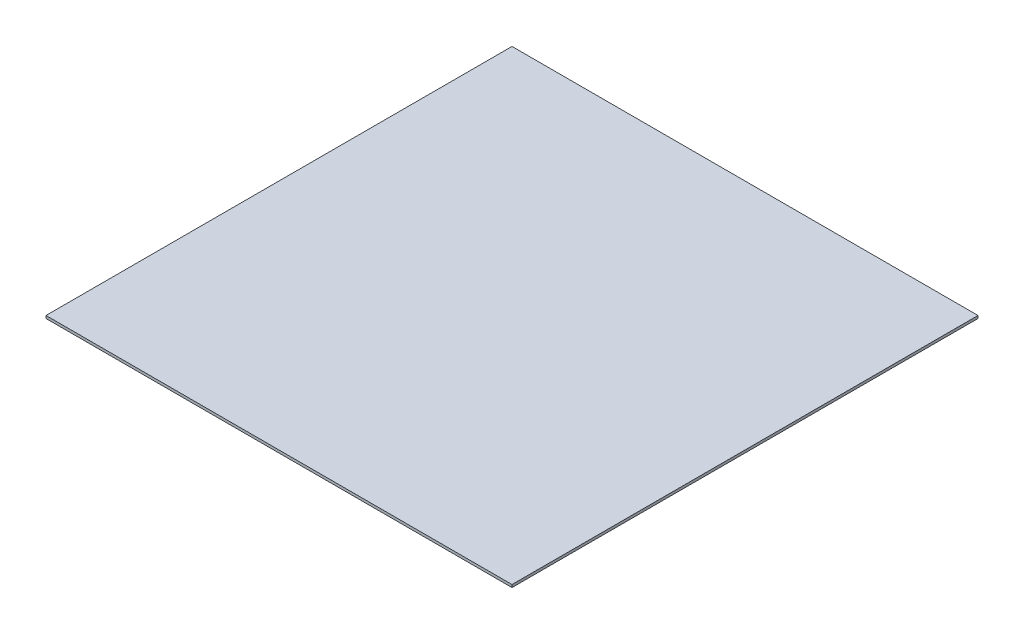
ISO-10303-21;
HEADER;
FILE_DESCRIPTION(('STEP AP214'),'2;1');
FILE_NAME('part.step','',(''),(''),'','','');
FILE_SCHEMA(('AUTOMOTIVE_DESIGN { 1 0 10303 214 1 1 1 1 }'));
ENDSEC;
DATA;
#1=APPLICATION_CONTEXT('core data for automotive mechanical design processes');
#2=APPLICATION_PROTOCOL_DEFINITION('international standard','automotive_design',2000,#1);
#3=PRODUCT_CONTEXT('',#1,'mechanical');
#4=PRODUCT('Part','Part','',(#3));
#5=PRODUCT_RELATED_PRODUCT_CATEGORY('part','',(#4));
#6=PRODUCT_DEFINITION_FORMATION('','',#4);
#7=PRODUCT_DEFINITION_CONTEXT('part definition',#1,'design');
#8=PRODUCT_DEFINITION('design','',#6,#7);
#9=PRODUCT_DEFINITION_SHAPE('','',#8);
#10=(LENGTH_UNIT() NAMED_UNIT(*) SI_UNIT(.MILLI.,.METRE.));
#11=(NAMED_UNIT(*) PLANE_ANGLE_UNIT() SI_UNIT($,.RADIAN.));
#12=(NAMED_UNIT(*) SI_UNIT($,.STERADIAN.) SOLID_ANGLE_UNIT());
#13=UNCERTAINTY_MEASURE_WITH_UNIT(LENGTH_MEASURE(1.E-05),#10,'distance_accuracy_value','');
#14=(GEOMETRIC_REPRESENTATION_CONTEXT(3) GLOBAL_UNCERTAINTY_ASSIGNED_CONTEXT((#13)) GLOBAL_UNIT_ASSIGNED_CONTEXT((#10,
#11,#12)) REPRESENTATION_CONTEXT('',''));
#15=CARTESIAN_POINT('',(0.,0.,0.));
#16=DIRECTION('',(0.,0.,1.));
#17=DIRECTION('',(1.,0.,0.));
#18=AXIS2_PLACEMENT_3D('',#15,#16,#17);
#19=CARTESIAN_POINT('',(0.,0.127,0.));
#20=DIRECTION('',(-1.,0.,0.));
#21=DIRECTION('',(0.,0.,1.));
#22=AXIS2_PLACEMENT_3D('',#19,#20,#21);
#23=PLANE('',#22);
#24=DIRECTION('',(0.,0.,-1.));
#25=VECTOR('',#24,1.);
#26=CARTESIAN_POINT('',(0.,0.,0.));
#27=LINE('',#26,#25);
#28=CARTESIAN_POINT('',(0.,0.,0.));
#29=VERTEX_POINT('',#28);
#30=CARTESIAN_POINT('',(0.,0.,-22.352));
#31=VERTEX_POINT('',#30);
#32=EDGE_CURVE('E99',#29,#31,#27,.T.);
#33=ORIENTED_EDGE('',*,*,#32,.F.);
#34=DIRECTION('',(0.,-1.,0.));
#35=VECTOR('',#34,1.);
#36=CARTESIAN_POINT('',(0.,0.127,0.));
#37=LINE('',#36,#35);
#38=CARTESIAN_POINT('',(0.,0.127,0.));
#39=VERTEX_POINT('',#38);
#40=EDGE_CURVE('E11',#39,#29,#37,.T.);
#41=ORIENTED_EDGE('',*,*,#40,.F.);
#42=DIRECTION('',(0.,0.,-1.));
#43=VECTOR('',#42,1.);
#44=CARTESIAN_POINT('',(0.,0.127,0.));
#45=LINE('',#44,#43);
#46=CARTESIAN_POINT('',(0.,0.127,-22.352));
#47=VERTEX_POINT('',#46);
#48=EDGE_CURVE('E94',#39,#47,#45,.T.);
#49=ORIENTED_EDGE('',*,*,#48,.T.);
#50=DIRECTION('',(0.,-1.,0.));
#51=VECTOR('',#50,1.);
#52=CARTESIAN_POINT('',(0.,0.127,-22.352));
#53=LINE('',#52,#51);
#54=EDGE_CURVE('E37',#47,#31,#53,.T.);
#55=ORIENTED_EDGE('',*,*,#54,.T.);
#56=EDGE_LOOP('',(#33,#41,#49,#55));
#57=FACE_BOUND('',#56,.T.);
#58=ADVANCED_FACE('F34',(#57),#23,.T.);
#59=CARTESIAN_POINT('',(0.,0.127,0.));
#60=DIRECTION('',(0.,0.,-1.));
#61=DIRECTION('',(-1.,0.,0.));
#62=AXIS2_PLACEMENT_3D('',#59,#60,#61);
#63=PLANE('',#62);
#64=DIRECTION('',(1.,0.,0.));
#65=VECTOR('',#64,1.);
#66=CARTESIAN_POINT('',(0.,0.,0.));
#67=LINE('',#66,#65);
#68=CARTESIAN_POINT('',(22.352,0.,0.));
#69=VERTEX_POINT('',#68);
#70=EDGE_CURVE('E67',#29,#69,#67,.T.);
#71=ORIENTED_EDGE('',*,*,#70,.T.);
#72=DIRECTION('',(0.,-1.,0.));
#73=VECTOR('',#72,1.);
#74=CARTESIAN_POINT('',(22.352,0.127,0.));
#75=LINE('',#74,#73);
#76=CARTESIAN_POINT('',(22.352,0.127,0.));
#77=VERTEX_POINT('',#76);
#78=EDGE_CURVE('E43',#77,#69,#75,.T.);
#79=ORIENTED_EDGE('',*,*,#78,.F.);
#80=DIRECTION('',(1.,0.,0.));
#81=VECTOR('',#80,1.);
#82=CARTESIAN_POINT('',(0.,0.127,0.));
#83=LINE('',#82,#81);
#84=EDGE_CURVE('E84',#39,#77,#83,.T.);
#85=ORIENTED_EDGE('',*,*,#84,.F.);
#86=ORIENTED_EDGE('',*,*,#40,.T.);
#87=EDGE_LOOP('',(#71,#79,#85,#86));
#88=FACE_BOUND('',#87,.T.);
#89=ADVANCED_FACE('F109',(#88),#63,.F.);
#90=CARTESIAN_POINT('',(22.352,0.127,0.));
#91=DIRECTION('',(-1.,0.,0.));
#92=DIRECTION('',(0.,0.,1.));
#93=AXIS2_PLACEMENT_3D('',#90,#91,#92);
#94=PLANE('',#93);
#95=DIRECTION('',(0.,0.,-1.));
#96=VECTOR('',#95,1.);
#97=CARTESIAN_POINT('',(22.352,0.,0.));
#98=LINE('',#97,#96);
#99=CARTESIAN_POINT('',(22.352,0.,-22.352));
#100=VERTEX_POINT('',#99);
#101=EDGE_CURVE('E91',#69,#100,#98,.T.);
#102=ORIENTED_EDGE('',*,*,#101,.T.);
#103=DIRECTION('',(0.,-1.,0.));
#104=VECTOR('',#103,1.);
#105=CARTESIAN_POINT('',(22.352,0.127,-22.352));
#106=LINE('',#105,#104);
#107=CARTESIAN_POINT('',(22.352,0.127,-22.352));
#108=VERTEX_POINT('',#107);
#109=EDGE_CURVE('E88',#108,#100,#106,.T.);
#110=ORIENTED_EDGE('',*,*,#109,.F.);
#111=DIRECTION('',(0.,0.,-1.));
#112=VECTOR('',#111,1.);
#113=CARTESIAN_POINT('',(22.352,0.127,0.));
#114=LINE('',#113,#112);
#115=EDGE_CURVE('E79',#77,#108,#114,.T.);
#116=ORIENTED_EDGE('',*,*,#115,.F.);
#117=ORIENTED_EDGE('',*,*,#78,.T.);
#118=EDGE_LOOP('',(#102,#110,#116,#117));
#119=FACE_BOUND('',#118,.T.);
#120=ADVANCED_FACE('F89',(#119),#94,.F.);
#121=CARTESIAN_POINT('',(0.,0.127,-22.352));
#122=DIRECTION('',(0.,0.,-1.));
#123=DIRECTION('',(-1.,0.,0.));
#124=AXIS2_PLACEMENT_3D('',#121,#122,#123);
#125=PLANE('',#124);
#126=DIRECTION('',(1.,0.,0.));
#127=VECTOR('',#126,1.);
#128=CARTESIAN_POINT('',(0.,0.,-22.352));
#129=LINE('',#128,#127);
#130=EDGE_CURVE('E102',#31,#100,#129,.T.);
#131=ORIENTED_EDGE('',*,*,#130,.F.);
#132=ORIENTED_EDGE('',*,*,#54,.F.);
#133=DIRECTION('',(1.,0.,0.));
#134=VECTOR('',#133,1.);
#135=CARTESIAN_POINT('',(0.,0.127,-22.352));
#136=LINE('',#135,#134);
#137=EDGE_CURVE('E83',#47,#108,#136,.T.);
#138=ORIENTED_EDGE('',*,*,#137,.T.);
#139=ORIENTED_EDGE('',*,*,#109,.T.);
#140=EDGE_LOOP('',(#131,#132,#138,#139));
#141=FACE_BOUND('',#140,.T.);
#142=ADVANCED_FACE('F93',(#141),#125,.T.);
#143=CARTESIAN_POINT('',(0.,0.127,0.));
#144=DIRECTION('',(0.,-1.,0.));
#145=DIRECTION('',(0.,0.,-1.));
#146=AXIS2_PLACEMENT_3D('',#143,#144,#145);
#147=PLANE('',#146);
#148=ORIENTED_EDGE('',*,*,#48,.F.);
#149=ORIENTED_EDGE('',*,*,#84,.T.);
#150=ORIENTED_EDGE('',*,*,#115,.T.);
#151=ORIENTED_EDGE('',*,*,#137,.F.);
#152=EDGE_LOOP('',(#148,#149,#150,#151));
#153=FACE_BOUND('',#152,.T.);
#154=ADVANCED_FACE('F82',(#153),#147,.F.);
#155=CARTESIAN_POINT('',(0.,0.,0.));
#156=DIRECTION('',(0.,-1.,0.));
#157=DIRECTION('',(0.,0.,-1.));
#158=AXIS2_PLACEMENT_3D('',#155,#156,#157);
#159=PLANE('',#158);
#160=ORIENTED_EDGE('',*,*,#32,.T.);
#161=ORIENTED_EDGE('',*,*,#130,.T.);
#162=ORIENTED_EDGE('',*,*,#101,.F.);
#163=ORIENTED_EDGE('',*,*,#70,.F.);
#164=EDGE_LOOP('',(#160,#161,#162,#163));
#165=FACE_BOUND('',#164,.T.);
#166=ADVANCED_FACE('F107',(#165),#159,.T.);
#167=CLOSED_SHELL('',(#58,#89,#120,#142,#154,#166));
#168=MANIFOLD_SOLID_BREP('B2',#167);
#169=ADVANCED_BREP_SHAPE_REPRESENTATION('',(#18,#168),#14);
#170=SHAPE_DEFINITION_REPRESENTATION(#9,#169);
ENDSEC;
END-ISO-10303-21;
